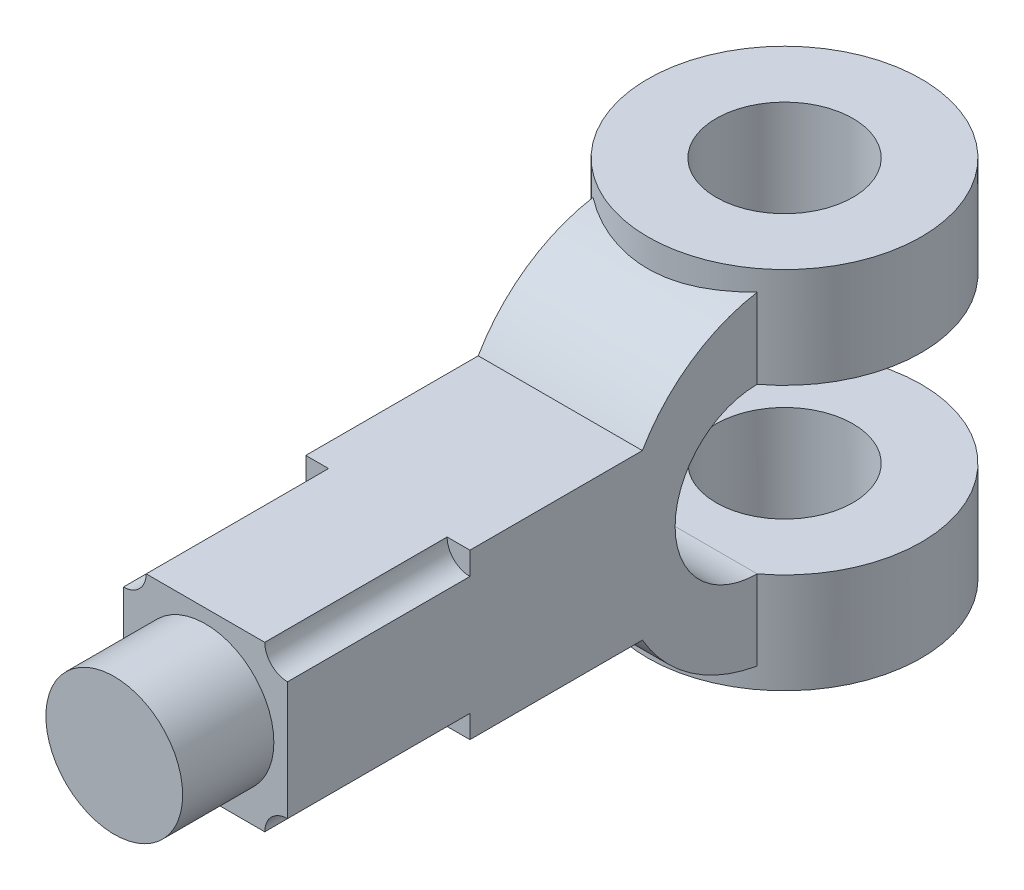
ISO-10303-21;
HEADER;
FILE_DESCRIPTION(('STEP AP214'),'2;1');
FILE_NAME('part.step','',(''),(''),'','','');
FILE_SCHEMA(('AUTOMOTIVE_DESIGN { 1 0 10303 214 1 1 1 1 }'));
ENDSEC;
DATA;
#1=APPLICATION_CONTEXT('core data for automotive mechanical design processes');
#2=APPLICATION_PROTOCOL_DEFINITION('international standard','automotive_design',2000,#1);
#3=PRODUCT_CONTEXT('',#1,'mechanical');
#4=PRODUCT('Part','Part','',(#3));
#5=PRODUCT_RELATED_PRODUCT_CATEGORY('part','',(#4));
#6=PRODUCT_DEFINITION_FORMATION('','',#4);
#7=PRODUCT_DEFINITION_CONTEXT('part definition',#1,'design');
#8=PRODUCT_DEFINITION('design','',#6,#7);
#9=PRODUCT_DEFINITION_SHAPE('','',#8);
#10=(LENGTH_UNIT() NAMED_UNIT(*) SI_UNIT(.MILLI.,.METRE.));
#11=(NAMED_UNIT(*) PLANE_ANGLE_UNIT() SI_UNIT($,.RADIAN.));
#12=(NAMED_UNIT(*) SI_UNIT($,.STERADIAN.) SOLID_ANGLE_UNIT());
#13=UNCERTAINTY_MEASURE_WITH_UNIT(LENGTH_MEASURE(1.E-05),#10,'distance_accuracy_value','');
#14=(GEOMETRIC_REPRESENTATION_CONTEXT(3) GLOBAL_UNCERTAINTY_ASSIGNED_CONTEXT((#13)) GLOBAL_UNIT_ASSIGNED_CONTEXT((#10,
#11,#12)) REPRESENTATION_CONTEXT('',''));
#15=CARTESIAN_POINT('',(0.,0.,0.));
#16=DIRECTION('',(0.,0.,1.));
#17=DIRECTION('',(1.,0.,0.));
#18=AXIS2_PLACEMENT_3D('',#15,#16,#17);
#19=CARTESIAN_POINT('',(0.,40.,-18.));
#20=DIRECTION('',(0.,-1.,0.));
#21=DIRECTION('',(0.,0.,-1.));
#22=AXIS2_PLACEMENT_3D('',#19,#20,#21);
#23=CYLINDRICAL_SURFACE('',#22,30.);
#24=CARTESIAN_POINT('',(0.,40.,-18.));
#25=DIRECTION('',(0.,1.,0.));
#26=DIRECTION('',(0.,0.,1.));
#27=AXIS2_PLACEMENT_3D('',#24,#25,#26);
#28=CIRCLE('',#27,30.);
#29=CARTESIAN_POINT('',(0.,40.,12.));
#30=VERTEX_POINT('',#29);
#31=EDGE_CURVE('E424',#30,#30,#28,.T.);
#32=ORIENTED_EDGE('',*,*,#31,.F.);
#33=EDGE_LOOP('',(#32));
#34=FACE_BOUND('',#33,.T.);
#35=DIRECTION('',(0.,-1.,0.));
#36=VECTOR('',#35,1.);
#37=CARTESIAN_POINT('',(18.,40.,6.00000000000001));
#38=LINE('',#37,#36);
#39=CARTESIAN_POINT('',(18.,18.,6.00000000000001));
#40=VERTEX_POINT('',#39);
#41=CARTESIAN_POINT('',(18.,35.4964786985977,6.00000000000001));
#42=VERTEX_POINT('',#41);
#43=EDGE_CURVE('E63',#40,#42,#38,.F.);
#44=ORIENTED_EDGE('',*,*,#43,.F.);
#45=CARTESIAN_POINT('',(0.,18.,-18.));
#46=DIRECTION('',(0.,1.,0.));
#47=DIRECTION('',(0.,0.,1.));
#48=AXIS2_PLACEMENT_3D('',#45,#46,#47);
#49=CIRCLE('',#48,30.);
#50=CARTESIAN_POINT('',(-18.,18.,6.00000000000001));
#51=VERTEX_POINT('',#50);
#52=EDGE_CURVE('E11',#40,#51,#49,.T.);
#53=ORIENTED_EDGE('',*,*,#52,.T.);
#54=DIRECTION('',(0.,-1.,0.));
#55=VECTOR('',#54,1.);
#56=CARTESIAN_POINT('',(-18.,40.,6.00000000000001));
#57=LINE('',#56,#55);
#58=CARTESIAN_POINT('',(-18.,35.4964786985977,6.00000000000001));
#59=VERTEX_POINT('',#58);
#60=EDGE_CURVE('E190',#51,#59,#57,.F.);
#61=ORIENTED_EDGE('',*,*,#60,.T.);
#62=CARTESIAN_POINT('',(-18.,35.4964786985977,6.00000000000001));
#63=CARTESIAN_POINT('',(-17.6652700488393,35.4540418888587,6.25104473685099));
#64=CARTESIAN_POINT('',(-17.3254588894004,35.4100755694517,6.49496287696561));
#65=CARTESIAN_POINT('',(-16.6361411055441,35.319987473131,6.96825300899079));
#66=CARTESIAN_POINT('',(-16.2866346965156,35.2738657440861,7.19762532367884));
#67=CARTESIAN_POINT('',(-15.224361309931,35.1336344154504,7.86343082113275));
#68=CARTESIAN_POINT('',(-14.4977350021615,35.0376448117858,8.2776313976723));
#69=CARTESIAN_POINT('',(-13.0106176994707,34.8474787700588,9.04488294946013));
#70=CARTESIAN_POINT('',(-12.2500524899578,34.7533070226002,9.39779073894099));
#71=CARTESIAN_POINT('',(-10.7011678817452,34.5735266205256,10.0390335159108));
#72=CARTESIAN_POINT('',(-9.91284943807475,34.4879176716399,10.3273707228594));
#73=CARTESIAN_POINT('',(-8.31212470789288,34.3309600251857,10.8377438083523));
#74=CARTESIAN_POINT('',(-7.49967959830294,34.2596359207948,11.0596656635286));
#75=CARTESIAN_POINT('',(-5.85756686392513,34.1363153236976,11.4346414692799));
#76=CARTESIAN_POINT('',(-5.02789921294297,34.0843188603897,11.5876953151035));
#77=CARTESIAN_POINT('',(-3.35910195711359,34.0033342771181,11.8232314080764));
#78=CARTESIAN_POINT('',(-2.51999361286517,33.9743021094198,11.9058487829932));
#79=CARTESIAN_POINT('',(-0.837326391333098,33.9411109954274,12.0001475979776));
#80=CARTESIAN_POINT('',(0.0062322712766498,33.9369508601431,12.0118324289261));
#81=CARTESIAN_POINT('',(1.65641745383172,33.9534385684128,11.9651363869785));
#82=CARTESIAN_POINT('',(2.4631369107436,33.9730738114726,11.909615532602));
#83=CARTESIAN_POINT('',(4.0686355518279,34.0342002504836,11.7337910476514));
#84=CARTESIAN_POINT('',(4.86741476119715,34.0756913770568,11.6134876227192));
#85=CARTESIAN_POINT('',(6.45265415602401,34.1779599907159,11.3089702469637));
#86=CARTESIAN_POINT('',(7.23909400302906,34.2387663955664,11.1246604304813));
#87=CARTESIAN_POINT('',(8.79328139515307,34.3758027333783,10.6937011780317));
#88=CARTESIAN_POINT('',(9.56102960596234,34.4520321161576,10.4470539657408));
#89=CARTESIAN_POINT('',(11.0051246545398,34.6077849465168,9.91817044679554));
#90=CARTESIAN_POINT('',(11.6834816686488,34.6863954939845,9.64113018835518));
#91=CARTESIAN_POINT('',(13.0176164276969,34.848297542607,9.03844326314263));
#92=CARTESIAN_POINT('',(13.6733957757199,34.9315887103135,8.71280005612538));
#93=CARTESIAN_POINT('',(14.9576830790064,35.0981755297543,8.01538337331857));
#94=CARTESIAN_POINT('',(15.5862582351749,35.1814705933355,7.64373349889216));
#95=CARTESIAN_POINT('',(16.8151014620769,35.3435474469705,6.85529510397645));
#96=CARTESIAN_POINT('',(17.4153673853043,35.4223288947237,6.43850316694264));
#97=CARTESIAN_POINT('',(18.,35.4964786985977,6.00000000000001));
#98=B_SPLINE_CURVE_WITH_KNOTS('',3,(#62,#63,#64,#65,#66,#67,#68,#69,#70,#71,#72,#73,#74,#75,#76,
#77,#78,#79,#80,#81,#82,#83,#84,#85,#86,#87,#88,#89,#90,#91,#92,#93,#94,#95,#96,#97),
.UNSPECIFIED.,.F.,.F.,(4,2,2,2,2,2,2,2,2,2,2,2,2,2,2,2,2,4),(0.,1.26147095102303,
2.52291389971485,5.04540453498827,7.57371092237957,10.1019303919279,12.6344657887177,
15.1670050376009,17.6946747720574,20.2222236720689,22.6458882558407,25.0695451461254,
27.4968478401918,29.9240639606397,32.1329767018888,34.3417322786998,36.5446776134851,
38.7477897932641),.UNSPECIFIED.);
#99=EDGE_CURVE('E343',#59,#42,#98,.T.);
#100=ORIENTED_EDGE('',*,*,#99,.T.);
#101=EDGE_LOOP('',(#44,#53,#61,#100));
#102=FACE_BOUND('',#101,.T.);
#103=ADVANCED_FACE('F45',(#34,#102),#23,.T.);
#104=CARTESIAN_POINT('',(18.,0.,0.));
#105=DIRECTION('',(-1.,0.,0.));
#106=DIRECTION('',(0.,0.,1.));
#107=AXIS2_PLACEMENT_3D('',#104,#105,#106);
#108=CYLINDRICAL_SURFACE('',#107,36.);
#109=CARTESIAN_POINT('',(18.,-35.4964786985977,6.00000000000001));
#110=CARTESIAN_POINT('',(17.6652700488393,-35.4540418888587,6.25104473685099));
#111=CARTESIAN_POINT('',(17.3254588894004,-35.4100755694517,6.49496287696561));
#112=CARTESIAN_POINT('',(16.6361411055441,-35.319987473131,6.96825300899079));
#113=CARTESIAN_POINT('',(16.2866346965156,-35.2738657440861,7.19762532367884));
#114=CARTESIAN_POINT('',(15.224361309931,-35.1336344154504,7.86343082113275));
#115=CARTESIAN_POINT('',(14.4977350021615,-35.0376448117858,8.2776313976723));
#116=CARTESIAN_POINT('',(13.0106176994707,-34.8474787700588,9.04488294946013));
#117=CARTESIAN_POINT('',(12.2500524899578,-34.7533070226002,9.39779073894099));
#118=CARTESIAN_POINT('',(10.7011678817452,-34.5735266205256,10.0390335159108));
#119=CARTESIAN_POINT('',(9.91284943807475,-34.4879176716399,10.3273707228594));
#120=CARTESIAN_POINT('',(8.31212470789288,-34.3309600251857,10.8377438083523));
#121=CARTESIAN_POINT('',(7.49967959830294,-34.2596359207948,11.0596656635286));
#122=CARTESIAN_POINT('',(5.85756686392513,-34.1363153236976,11.4346414692799));
#123=CARTESIAN_POINT('',(5.02789921294297,-34.0843188603897,11.5876953151035));
#124=CARTESIAN_POINT('',(3.35910195711359,-34.0033342771181,11.8232314080764));
#125=CARTESIAN_POINT('',(2.51999361286517,-33.9743021094198,11.9058487829932));
#126=CARTESIAN_POINT('',(0.837326391333098,-33.9411109954274,12.0001475979776));
#127=CARTESIAN_POINT('',(-0.0062322712766498,-33.9369508601431,12.0118324289261));
#128=CARTESIAN_POINT('',(-1.65641745383172,-33.9534385684128,11.9651363869785));
#129=CARTESIAN_POINT('',(-2.4631369107436,-33.9730738114726,11.909615532602));
#130=CARTESIAN_POINT('',(-4.0686355518279,-34.0342002504836,11.7337910476514));
#131=CARTESIAN_POINT('',(-4.86741476119715,-34.0756913770568,11.6134876227192));
#132=CARTESIAN_POINT('',(-6.45265415602401,-34.1779599907159,11.3089702469637));
#133=CARTESIAN_POINT('',(-7.23909400302906,-34.2387663955664,11.1246604304813));
#134=CARTESIAN_POINT('',(-8.79328139515307,-34.3758027333783,10.6937011780317));
#135=CARTESIAN_POINT('',(-9.56102960596234,-34.4520321161576,10.4470539657408));
#136=CARTESIAN_POINT('',(-11.0051246545398,-34.6077849465168,9.91817044679554));
#137=CARTESIAN_POINT('',(-11.6834816686488,-34.6863954939845,9.64113018835518));
#138=CARTESIAN_POINT('',(-13.0176164276969,-34.848297542607,9.03844326314263));
#139=CARTESIAN_POINT('',(-13.6733957757199,-34.9315887103135,8.71280005612538));
#140=CARTESIAN_POINT('',(-14.9576830790064,-35.0981755297543,8.01538337331857));
#141=CARTESIAN_POINT('',(-15.5862582351749,-35.1814705933355,7.64373349889216));
#142=CARTESIAN_POINT('',(-16.8151014620769,-35.3435474469705,6.85529510397645));
#143=CARTESIAN_POINT('',(-17.4153673853043,-35.4223288947237,6.43850316694264));
#144=CARTESIAN_POINT('',(-18.,-35.4964786985977,6.00000000000001));
#145=B_SPLINE_CURVE_WITH_KNOTS('',3,(#109,#110,#111,#112,#113,#114,#115,#116,#117,#118,#119,
#120,#121,#122,#123,#124,#125,#126,#127,#128,#129,#130,#131,#132,#133,#134,#135,#136,#137,#138,
#139,#140,#141,#142,#143,#144),.UNSPECIFIED.,.F.,.F.,(4,2,2,2,2,2,2,2,2,2,2,2,2,2,2,2,2,4),(0.,
1.26147095102303,2.52291389971485,5.04540453498827,7.57371092237957,10.1019303919279,
12.6344657887177,15.1670050376009,17.6946747720574,20.2222236720689,22.6458882558407,
25.0695451461254,27.4968478401918,29.9240639606397,32.1329767018888,34.3417322786998,
36.5446776134851,38.7477897932641),.UNSPECIFIED.);
#146=CARTESIAN_POINT('',(18.,-35.4964786985977,6.00000000000001));
#147=VERTEX_POINT('',#146);
#148=CARTESIAN_POINT('',(-18.,-35.4964786985977,6.00000000000001));
#149=VERTEX_POINT('',#148);
#150=EDGE_CURVE('E71',#147,#149,#145,.T.);
#151=ORIENTED_EDGE('',*,*,#150,.F.);
#152=CARTESIAN_POINT('',(18.,0.,0.));
#153=DIRECTION('',(1.,0.,0.));
#154=DIRECTION('',(0.,0.,-1.));
#155=AXIS2_PLACEMENT_3D('',#152,#153,#154);
#156=CIRCLE('',#155,36.);
#157=CARTESIAN_POINT('',(18.,-18.,31.1769145362398));
#158=VERTEX_POINT('',#157);
#159=EDGE_CURVE('E205',#158,#147,#156,.T.);
#160=ORIENTED_EDGE('',*,*,#159,.F.);
#161=DIRECTION('',(-1.,0.,0.));
#162=VECTOR('',#161,1.);
#163=CARTESIAN_POINT('',(18.,-18.,31.1769145362398));
#164=LINE('',#163,#162);
#165=CARTESIAN_POINT('',(-18.,-18.,31.1769145362398));
#166=VERTEX_POINT('',#165);
#167=EDGE_CURVE('E212',#166,#158,#164,.F.);
#168=ORIENTED_EDGE('',*,*,#167,.F.);
#169=CARTESIAN_POINT('',(-18.,0.,0.));
#170=DIRECTION('',(1.,0.,0.));
#171=DIRECTION('',(0.,0.,-1.));
#172=AXIS2_PLACEMENT_3D('',#169,#170,#171);
#173=CIRCLE('',#172,36.);
#174=EDGE_CURVE('E200',#166,#149,#173,.T.);
#175=ORIENTED_EDGE('',*,*,#174,.T.);
#176=EDGE_LOOP('',(#151,#160,#168,#175));
#177=FACE_BOUND('',#176,.T.);
#178=ADVANCED_FACE('F47',(#177),#108,.T.);
#179=ORIENTED_EDGE('',*,*,#99,.F.);
#180=CARTESIAN_POINT('',(-18.,18.,31.1769145362398));
#181=VERTEX_POINT('',#180);
#182=EDGE_CURVE('E204',#59,#181,#173,.T.);
#183=ORIENTED_EDGE('',*,*,#182,.T.);
#184=DIRECTION('',(-1.,0.,0.));
#185=VECTOR('',#184,1.);
#186=CARTESIAN_POINT('',(18.,18.,31.1769145362398));
#187=LINE('',#186,#185);
#188=CARTESIAN_POINT('',(18.,18.,31.1769145362398));
#189=VERTEX_POINT('',#188);
#190=EDGE_CURVE('E208',#189,#181,#187,.T.);
#191=ORIENTED_EDGE('',*,*,#190,.F.);
#192=EDGE_CURVE('E203',#42,#189,#156,.T.);
#193=ORIENTED_EDGE('',*,*,#192,.F.);
#194=EDGE_LOOP('',(#179,#183,#191,#193));
#195=FACE_BOUND('',#194,.T.);
#196=ADVANCED_FACE('F411',(#195),#108,.T.);
#197=CARTESIAN_POINT('',(18.,0.,0.));
#198=DIRECTION('',(1.,0.,0.));
#199=DIRECTION('',(0.,0.,-1.));
#200=AXIS2_PLACEMENT_3D('',#197,#198,#199);
#201=PLANE('',#200);
#202=CARTESIAN_POINT('',(18.,0.,6.00000000000001));
#203=DIRECTION('',(1.,0.,0.));
#204=DIRECTION('',(0.,0.,-1.));
#205=AXIS2_PLACEMENT_3D('',#202,#203,#204);
#206=CIRCLE('',#205,18.);
#207=CARTESIAN_POINT('',(18.,-18.,6.00000000000001));
#208=VERTEX_POINT('',#207);
#209=EDGE_CURVE('E180',#40,#208,#206,.T.);
#210=ORIENTED_EDGE('',*,*,#209,.F.);
#211=ORIENTED_EDGE('',*,*,#43,.T.);
#212=ORIENTED_EDGE('',*,*,#192,.T.);
#213=DIRECTION('',(0.,0.,-1.));
#214=VECTOR('',#213,1.);
#215=CARTESIAN_POINT('',(18.,18.,109.));
#216=LINE('',#215,#214);
#217=CARTESIAN_POINT('',(18.,18.,69.));
#218=VERTEX_POINT('',#217);
#219=EDGE_CURVE('E216',#218,#189,#216,.T.);
#220=ORIENTED_EDGE('',*,*,#219,.F.);
#221=DIRECTION('',(0.,1.,0.));
#222=VECTOR('',#221,1.);
#223=CARTESIAN_POINT('',(18.,18.,69.));
#224=LINE('',#223,#222);
#225=CARTESIAN_POINT('',(18.,13.,69.));
#226=VERTEX_POINT('',#225);
#227=EDGE_CURVE('E264',#226,#218,#224,.T.);
#228=ORIENTED_EDGE('',*,*,#227,.F.);
#229=DIRECTION('',(0.,0.,1.));
#230=VECTOR('',#229,1.);
#231=CARTESIAN_POINT('',(18.,13.,69.));
#232=LINE('',#231,#230);
#233=CARTESIAN_POINT('',(18.,13.,109.));
#234=VERTEX_POINT('',#233);
#235=EDGE_CURVE('E252',#226,#234,#232,.T.);
#236=ORIENTED_EDGE('',*,*,#235,.T.);
#237=DIRECTION('',(0.,1.,0.));
#238=VECTOR('',#237,1.);
#239=CARTESIAN_POINT('',(18.,18.,109.));
#240=LINE('',#239,#238);
#241=CARTESIAN_POINT('',(18.,-12.9999999999998,109.));
#242=VERTEX_POINT('',#241);
#243=EDGE_CURVE('E242',#242,#234,#240,.T.);
#244=ORIENTED_EDGE('',*,*,#243,.F.);
#245=DIRECTION('',(0.,0.,1.));
#246=VECTOR('',#245,1.);
#247=CARTESIAN_POINT('',(18.0000000000001,-12.9999999999998,69.));
#248=LINE('',#247,#246);
#249=CARTESIAN_POINT('',(18.0000000000001,-12.9999999999998,69.));
#250=VERTEX_POINT('',#249);
#251=EDGE_CURVE('E274',#250,#242,#248,.T.);
#252=ORIENTED_EDGE('',*,*,#251,.F.);
#253=DIRECTION('',(0.,1.,0.));
#254=VECTOR('',#253,1.);
#255=CARTESIAN_POINT('',(18.0000000000001,-12.9999999999998,69.));
#256=LINE('',#255,#254);
#257=CARTESIAN_POINT('',(18.0000000000002,-17.9999999999998,69.));
#258=VERTEX_POINT('',#257);
#259=EDGE_CURVE('E291',#258,#250,#256,.T.);
#260=ORIENTED_EDGE('',*,*,#259,.F.);
#261=DIRECTION('',(0.,0.,-1.));
#262=VECTOR('',#261,1.);
#263=CARTESIAN_POINT('',(18.,-18.,109.));
#264=LINE('',#263,#262);
#265=EDGE_CURVE('E227',#258,#158,#264,.T.);
#266=ORIENTED_EDGE('',*,*,#265,.T.);
#267=ORIENTED_EDGE('',*,*,#159,.T.);
#268=EDGE_CURVE('E287',#147,#208,#38,.F.);
#269=ORIENTED_EDGE('',*,*,#268,.T.);
#270=EDGE_LOOP('',(#210,#211,#212,#220,#228,#236,#244,#252,#260,#266,#267,#269));
#271=FACE_BOUND('',#270,.T.);
#272=ADVANCED_FACE('F409',(#271),#201,.T.);
#273=CARTESIAN_POINT('',(-18.,0.,0.));
#274=DIRECTION('',(1.,0.,0.));
#275=DIRECTION('',(0.,0.,-1.));
#276=AXIS2_PLACEMENT_3D('',#273,#274,#275);
#277=PLANE('',#276);
#278=ORIENTED_EDGE('',*,*,#60,.F.);
#279=CARTESIAN_POINT('',(-18.,0.,6.00000000000001));
#280=DIRECTION('',(1.,0.,0.));
#281=DIRECTION('',(0.,0.,-1.));
#282=AXIS2_PLACEMENT_3D('',#279,#280,#281);
#283=CIRCLE('',#282,18.);
#284=CARTESIAN_POINT('',(-18.,-18.,6.00000000000001));
#285=VERTEX_POINT('',#284);
#286=EDGE_CURVE('E178',#51,#285,#283,.T.);
#287=ORIENTED_EDGE('',*,*,#286,.T.);
#288=EDGE_CURVE('E171',#149,#285,#57,.F.);
#289=ORIENTED_EDGE('',*,*,#288,.F.);
#290=ORIENTED_EDGE('',*,*,#174,.F.);
#291=DIRECTION('',(0.,0.,-1.));
#292=VECTOR('',#291,1.);
#293=CARTESIAN_POINT('',(-18.,-18.,109.));
#294=LINE('',#293,#292);
#295=CARTESIAN_POINT('',(-18.,-18.,69.));
#296=VERTEX_POINT('',#295);
#297=EDGE_CURVE('E224',#296,#166,#294,.T.);
#298=ORIENTED_EDGE('',*,*,#297,.F.);
#299=DIRECTION('',(0.,-1.,0.));
#300=VECTOR('',#299,1.);
#301=CARTESIAN_POINT('',(-18.,-18.,69.));
#302=LINE('',#301,#300);
#303=CARTESIAN_POINT('',(-18.,-13.,69.));
#304=VERTEX_POINT('',#303);
#305=EDGE_CURVE('E307',#304,#296,#302,.T.);
#306=ORIENTED_EDGE('',*,*,#305,.F.);
#307=DIRECTION('',(0.,0.,1.));
#308=VECTOR('',#307,1.);
#309=CARTESIAN_POINT('',(-18.,-13.,69.));
#310=LINE('',#309,#308);
#311=CARTESIAN_POINT('',(-18.,-13.,109.));
#312=VERTEX_POINT('',#311);
#313=EDGE_CURVE('E299',#304,#312,#310,.T.);
#314=ORIENTED_EDGE('',*,*,#313,.T.);
#315=DIRECTION('',(0.,-1.,0.));
#316=VECTOR('',#315,1.);
#317=CARTESIAN_POINT('',(-18.,18.,109.));
#318=LINE('',#317,#316);
#319=CARTESIAN_POINT('',(-18.,12.9999999999999,109.));
#320=VERTEX_POINT('',#319);
#321=EDGE_CURVE('E234',#320,#312,#318,.T.);
#322=ORIENTED_EDGE('',*,*,#321,.F.);
#323=DIRECTION('',(0.,0.,1.));
#324=VECTOR('',#323,1.);
#325=CARTESIAN_POINT('',(-18.,12.9999999999999,69.));
#326=LINE('',#325,#324);
#327=CARTESIAN_POINT('',(-18.,12.9999999999999,69.));
#328=VERTEX_POINT('',#327);
#329=EDGE_CURVE('E316',#328,#320,#326,.T.);
#330=ORIENTED_EDGE('',*,*,#329,.F.);
#331=DIRECTION('',(0.,-1.,0.));
#332=VECTOR('',#331,1.);
#333=CARTESIAN_POINT('',(-18.,12.9999999999999,69.));
#334=LINE('',#333,#332);
#335=CARTESIAN_POINT('',(-18.0000000000001,17.9999999999999,69.));
#336=VERTEX_POINT('',#335);
#337=EDGE_CURVE('E329',#336,#328,#334,.T.);
#338=ORIENTED_EDGE('',*,*,#337,.F.);
#339=DIRECTION('',(0.,0.,-1.));
#340=VECTOR('',#339,1.);
#341=CARTESIAN_POINT('',(-18.,18.,109.));
#342=LINE('',#341,#340);
#343=EDGE_CURVE('E220',#336,#181,#342,.T.);
#344=ORIENTED_EDGE('',*,*,#343,.T.);
#345=ORIENTED_EDGE('',*,*,#182,.F.);
#346=EDGE_LOOP('',(#278,#287,#289,#290,#298,#306,#314,#322,#330,#338,#344,#345));
#347=FACE_BOUND('',#346,.T.);
#348=ADVANCED_FACE('F187',(#347),#277,.F.);
#349=CARTESIAN_POINT('',(-18.,18.,109.));
#350=DIRECTION('',(0.,-1.,0.));
#351=DIRECTION('',(0.,0.,-1.));
#352=AXIS2_PLACEMENT_3D('',#349,#350,#351);
#353=PLANE('',#352);
#354=DIRECTION('',(-1.,0.,0.));
#355=VECTOR('',#354,1.);
#356=CARTESIAN_POINT('',(-18.0000000000001,17.9999999999999,69.));
#357=LINE('',#356,#355);
#358=CARTESIAN_POINT('',(-13.0000000000001,18.,69.));
#359=VERTEX_POINT('',#358);
#360=EDGE_CURVE('E325',#359,#336,#357,.T.);
#361=ORIENTED_EDGE('',*,*,#360,.F.);
#362=DIRECTION('',(0.,0.,1.));
#363=VECTOR('',#362,1.);
#364=CARTESIAN_POINT('',(-13.0000000000001,18.,69.));
#365=LINE('',#364,#363);
#366=CARTESIAN_POINT('',(-13.0000000000001,18.,109.));
#367=VERTEX_POINT('',#366);
#368=EDGE_CURVE('E265',#359,#367,#365,.T.);
#369=ORIENTED_EDGE('',*,*,#368,.T.);
#370=DIRECTION('',(-1.,0.,0.));
#371=VECTOR('',#370,1.);
#372=CARTESIAN_POINT('',(-18.,18.,109.));
#373=LINE('',#372,#371);
#374=CARTESIAN_POINT('',(13.,18.,109.));
#375=VERTEX_POINT('',#374);
#376=EDGE_CURVE('E238',#375,#367,#373,.T.);
#377=ORIENTED_EDGE('',*,*,#376,.F.);
#378=DIRECTION('',(0.,0.,1.));
#379=VECTOR('',#378,1.);
#380=CARTESIAN_POINT('',(13.,18.,69.));
#381=LINE('',#380,#379);
#382=CARTESIAN_POINT('',(13.,18.,69.));
#383=VERTEX_POINT('',#382);
#384=EDGE_CURVE('E253',#383,#375,#381,.T.);
#385=ORIENTED_EDGE('',*,*,#384,.F.);
#386=DIRECTION('',(-1.,0.,0.));
#387=VECTOR('',#386,1.);
#388=CARTESIAN_POINT('',(13.,18.,69.));
#389=LINE('',#388,#387);
#390=EDGE_CURVE('E269',#218,#383,#389,.T.);
#391=ORIENTED_EDGE('',*,*,#390,.F.);
#392=ORIENTED_EDGE('',*,*,#219,.T.);
#393=ORIENTED_EDGE('',*,*,#190,.T.);
#394=ORIENTED_EDGE('',*,*,#343,.F.);
#395=EDGE_LOOP('',(#361,#369,#377,#385,#391,#392,#393,#394));
#396=FACE_BOUND('',#395,.T.);
#397=ADVANCED_FACE('F404',(#396),#353,.F.);
#398=CARTESIAN_POINT('',(-18.,-18.,109.));
#399=DIRECTION('',(0.,1.,0.));
#400=DIRECTION('',(0.,0.,1.));
#401=AXIS2_PLACEMENT_3D('',#398,#399,#400);
#402=PLANE('',#401);
#403=DIRECTION('',(1.,0.,0.));
#404=VECTOR('',#403,1.);
#405=CARTESIAN_POINT('',(-18.,-18.,109.));
#406=LINE('',#405,#404);
#407=CARTESIAN_POINT('',(-13.,-18.,109.));
#408=VERTEX_POINT('',#407);
#409=CARTESIAN_POINT('',(13.0000000000002,-17.9999999999999,109.));
#410=VERTEX_POINT('',#409);
#411=EDGE_CURVE('E230',#408,#410,#406,.T.);
#412=ORIENTED_EDGE('',*,*,#411,.F.);
#413=DIRECTION('',(0.,0.,1.));
#414=VECTOR('',#413,1.);
#415=CARTESIAN_POINT('',(-13.,-18.,69.));
#416=LINE('',#415,#414);
#417=CARTESIAN_POINT('',(-13.,-18.,69.));
#418=VERTEX_POINT('',#417);
#419=EDGE_CURVE('E296',#418,#408,#416,.T.);
#420=ORIENTED_EDGE('',*,*,#419,.F.);
#421=DIRECTION('',(1.,0.,0.));
#422=VECTOR('',#421,1.);
#423=CARTESIAN_POINT('',(-13.,-18.,69.));
#424=LINE('',#423,#422);
#425=EDGE_CURVE('E311',#296,#418,#424,.T.);
#426=ORIENTED_EDGE('',*,*,#425,.F.);
#427=ORIENTED_EDGE('',*,*,#297,.T.);
#428=ORIENTED_EDGE('',*,*,#167,.T.);
#429=ORIENTED_EDGE('',*,*,#265,.F.);
#430=DIRECTION('',(1.,0.,0.));
#431=VECTOR('',#430,1.);
#432=CARTESIAN_POINT('',(18.0000000000002,-17.9999999999998,69.));
#433=LINE('',#432,#431);
#434=CARTESIAN_POINT('',(13.0000000000002,-17.9999999999999,69.));
#435=VERTEX_POINT('',#434);
#436=EDGE_CURVE('E286',#435,#258,#433,.T.);
#437=ORIENTED_EDGE('',*,*,#436,.F.);
#438=DIRECTION('',(0.,0.,1.));
#439=VECTOR('',#438,1.);
#440=CARTESIAN_POINT('',(13.0000000000002,-17.9999999999999,69.));
#441=LINE('',#440,#439);
#442=EDGE_CURVE('E277',#435,#410,#441,.T.);
#443=ORIENTED_EDGE('',*,*,#442,.T.);
#444=EDGE_LOOP('',(#412,#420,#426,#427,#428,#429,#437,#443));
#445=FACE_BOUND('',#444,.T.);
#446=ADVANCED_FACE('F400',(#445),#402,.F.);
#447=CARTESIAN_POINT('',(0.,0.,109.));
#448=DIRECTION('',(0.,0.,1.));
#449=DIRECTION('',(1.,0.,0.));
#450=AXIS2_PLACEMENT_3D('',#447,#448,#449);
#451=PLANE('',#450);
#452=CARTESIAN_POINT('',(-18.0000000000001,17.9999999999999,109.));
#453=DIRECTION('',(0.,0.,1.));
#454=DIRECTION('',(0.,1.,0.));
#455=AXIS2_PLACEMENT_3D('',#452,#453,#454);
#456=CIRCLE('',#455,5.);
#457=EDGE_CURVE('E304',#320,#367,#456,.T.);
#458=ORIENTED_EDGE('',*,*,#457,.F.);
#459=ORIENTED_EDGE('',*,*,#321,.T.);
#460=CARTESIAN_POINT('',(-18.,-18.,109.));
#461=DIRECTION('',(0.,0.,1.));
#462=DIRECTION('',(-1.,0.,0.));
#463=AXIS2_PLACEMENT_3D('',#460,#461,#462);
#464=CIRCLE('',#463,5.);
#465=EDGE_CURVE('E282',#408,#312,#464,.T.);
#466=ORIENTED_EDGE('',*,*,#465,.F.);
#467=ORIENTED_EDGE('',*,*,#411,.T.);
#468=CARTESIAN_POINT('',(18.0000000000002,-17.9999999999998,109.));
#469=DIRECTION('',(0.,0.,1.));
#470=DIRECTION('',(0.,-1.,0.));
#471=AXIS2_PLACEMENT_3D('',#468,#469,#470);
#472=CIRCLE('',#471,5.);
#473=EDGE_CURVE('E283',#242,#410,#472,.T.);
#474=ORIENTED_EDGE('',*,*,#473,.F.);
#475=ORIENTED_EDGE('',*,*,#243,.T.);
#476=CARTESIAN_POINT('',(18.,18.,109.));
#477=DIRECTION('',(0.,0.,1.));
#478=DIRECTION('',(1.,0.,0.));
#479=AXIS2_PLACEMENT_3D('',#476,#477,#478);
#480=CIRCLE('',#479,5.);
#481=EDGE_CURVE('E260',#375,#234,#480,.T.);
#482=ORIENTED_EDGE('',*,*,#481,.F.);
#483=ORIENTED_EDGE('',*,*,#376,.T.);
#484=EDGE_LOOP('',(#458,#459,#466,#467,#474,#475,#482,#483));
#485=FACE_BOUND('',#484,.T.);
#486=CARTESIAN_POINT('',(0.,0.,109.));
#487=DIRECTION('',(0.,0.,1.));
#488=DIRECTION('',(1.,0.,0.));
#489=AXIS2_PLACEMENT_3D('',#486,#487,#488);
#490=CIRCLE('',#489,15.);
#491=CARTESIAN_POINT('',(15.,0.,109.));
#492=VERTEX_POINT('',#491);
#493=EDGE_CURVE('E198',#492,#492,#490,.T.);
#494=ORIENTED_EDGE('',*,*,#493,.F.);
#495=EDGE_LOOP('',(#494));
#496=FACE_BOUND('',#495,.T.);
#497=ADVANCED_FACE('F396',(#485,#496),#451,.T.);
#498=CARTESIAN_POINT('',(0.,0.,129.));
#499=DIRECTION('',(0.,0.,-1.));
#500=DIRECTION('',(-1.,0.,0.));
#501=AXIS2_PLACEMENT_3D('',#498,#499,#500);
#502=CYLINDRICAL_SURFACE('',#501,15.);
#503=CARTESIAN_POINT('',(0.,0.,129.));
#504=DIRECTION('',(0.,0.,1.));
#505=DIRECTION('',(1.,0.,0.));
#506=AXIS2_PLACEMENT_3D('',#503,#504,#505);
#507=CIRCLE('',#506,15.);
#508=CARTESIAN_POINT('',(15.,0.,129.));
#509=VERTEX_POINT('',#508);
#510=EDGE_CURVE('E245',#509,#509,#507,.T.);
#511=ORIENTED_EDGE('',*,*,#510,.F.);
#512=EDGE_LOOP('',(#511));
#513=FACE_BOUND('',#512,.T.);
#514=ORIENTED_EDGE('',*,*,#493,.T.);
#515=EDGE_LOOP('',(#514));
#516=FACE_BOUND('',#515,.T.);
#517=ADVANCED_FACE('F392',(#513,#516),#502,.T.);
#518=CARTESIAN_POINT('',(0.,0.,129.));
#519=DIRECTION('',(0.,0.,1.));
#520=DIRECTION('',(1.,0.,0.));
#521=AXIS2_PLACEMENT_3D('',#518,#519,#520);
#522=PLANE('',#521);
#523=ORIENTED_EDGE('',*,*,#510,.T.);
#524=EDGE_LOOP('',(#523));
#525=FACE_BOUND('',#524,.T.);
#526=ADVANCED_FACE('F388',(#525),#522,.T.);
#527=CARTESIAN_POINT('',(18.,18.,69.));
#528=DIRECTION('',(0.,0.,1.));
#529=DIRECTION('',(1.,0.,0.));
#530=AXIS2_PLACEMENT_3D('',#527,#528,#529);
#531=CYLINDRICAL_SURFACE('',#530,5.);
#532=ORIENTED_EDGE('',*,*,#481,.T.);
#533=ORIENTED_EDGE('',*,*,#235,.F.);
#534=CARTESIAN_POINT('',(18.,18.,69.));
#535=DIRECTION('',(0.,0.,1.));
#536=DIRECTION('',(1.,0.,0.));
#537=AXIS2_PLACEMENT_3D('',#534,#535,#536);
#538=CIRCLE('',#537,5.);
#539=EDGE_CURVE('E256',#383,#226,#538,.T.);
#540=ORIENTED_EDGE('',*,*,#539,.F.);
#541=ORIENTED_EDGE('',*,*,#384,.T.);
#542=EDGE_LOOP('',(#532,#533,#540,#541));
#543=FACE_BOUND('',#542,.T.);
#544=ADVANCED_FACE('F384',(#543),#531,.F.);
#545=CARTESIAN_POINT('',(18.,18.,69.));
#546=DIRECTION('',(0.,0.,1.));
#547=DIRECTION('',(1.,0.,0.));
#548=AXIS2_PLACEMENT_3D('',#545,#546,#547);
#549=PLANE('',#548);
#550=ORIENTED_EDGE('',*,*,#227,.T.);
#551=ORIENTED_EDGE('',*,*,#390,.T.);
#552=ORIENTED_EDGE('',*,*,#539,.T.);
#553=EDGE_LOOP('',(#550,#551,#552));
#554=FACE_BOUND('',#553,.T.);
#555=ADVANCED_FACE('F380',(#554),#549,.T.);
#556=CARTESIAN_POINT('',(18.0000000000002,-17.9999999999998,69.));
#557=DIRECTION('',(0.,0.,1.));
#558=DIRECTION('',(1.,0.,0.));
#559=AXIS2_PLACEMENT_3D('',#556,#557,#558);
#560=CYLINDRICAL_SURFACE('',#559,5.);
#561=ORIENTED_EDGE('',*,*,#473,.T.);
#562=ORIENTED_EDGE('',*,*,#442,.F.);
#563=CARTESIAN_POINT('',(18.0000000000002,-17.9999999999998,69.));
#564=DIRECTION('',(0.,0.,1.));
#565=DIRECTION('',(0.,-1.,0.));
#566=AXIS2_PLACEMENT_3D('',#563,#564,#565);
#567=CIRCLE('',#566,5.);
#568=EDGE_CURVE('E278',#250,#435,#567,.T.);
#569=ORIENTED_EDGE('',*,*,#568,.F.);
#570=ORIENTED_EDGE('',*,*,#251,.T.);
#571=EDGE_LOOP('',(#561,#562,#569,#570));
#572=FACE_BOUND('',#571,.T.);
#573=ADVANCED_FACE('F376',(#572),#560,.F.);
#574=CARTESIAN_POINT('',(18.0000000000002,-17.9999999999998,69.));
#575=DIRECTION('',(0.,0.,1.));
#576=DIRECTION('',(0.,-1.,0.));
#577=AXIS2_PLACEMENT_3D('',#574,#575,#576);
#578=PLANE('',#577);
#579=ORIENTED_EDGE('',*,*,#436,.T.);
#580=ORIENTED_EDGE('',*,*,#259,.T.);
#581=ORIENTED_EDGE('',*,*,#568,.T.);
#582=EDGE_LOOP('',(#579,#580,#581));
#583=FACE_BOUND('',#582,.T.);
#584=ADVANCED_FACE('F372',(#583),#578,.T.);
#585=CARTESIAN_POINT('',(-18.,-18.,69.));
#586=DIRECTION('',(0.,0.,1.));
#587=DIRECTION('',(1.,0.,0.));
#588=AXIS2_PLACEMENT_3D('',#585,#586,#587);
#589=CYLINDRICAL_SURFACE('',#588,5.);
#590=ORIENTED_EDGE('',*,*,#465,.T.);
#591=ORIENTED_EDGE('',*,*,#313,.F.);
#592=CARTESIAN_POINT('',(-18.,-18.,69.));
#593=DIRECTION('',(0.,0.,1.));
#594=DIRECTION('',(-1.,0.,0.));
#595=AXIS2_PLACEMENT_3D('',#592,#593,#594);
#596=CIRCLE('',#595,5.);
#597=EDGE_CURVE('E300',#418,#304,#596,.T.);
#598=ORIENTED_EDGE('',*,*,#597,.F.);
#599=ORIENTED_EDGE('',*,*,#419,.T.);
#600=EDGE_LOOP('',(#590,#591,#598,#599));
#601=FACE_BOUND('',#600,.T.);
#602=ADVANCED_FACE('F368',(#601),#589,.F.);
#603=CARTESIAN_POINT('',(-18.,-18.,69.));
#604=DIRECTION('',(0.,0.,1.));
#605=DIRECTION('',(-1.,0.,0.));
#606=AXIS2_PLACEMENT_3D('',#603,#604,#605);
#607=PLANE('',#606);
#608=ORIENTED_EDGE('',*,*,#305,.T.);
#609=ORIENTED_EDGE('',*,*,#425,.T.);
#610=ORIENTED_EDGE('',*,*,#597,.T.);
#611=EDGE_LOOP('',(#608,#609,#610));
#612=FACE_BOUND('',#611,.T.);
#613=ADVANCED_FACE('F364',(#612),#607,.T.);
#614=CARTESIAN_POINT('',(-18.0000000000001,17.9999999999999,69.));
#615=DIRECTION('',(0.,0.,1.));
#616=DIRECTION('',(1.,0.,0.));
#617=AXIS2_PLACEMENT_3D('',#614,#615,#616);
#618=CYLINDRICAL_SURFACE('',#617,5.);
#619=ORIENTED_EDGE('',*,*,#457,.T.);
#620=ORIENTED_EDGE('',*,*,#368,.F.);
#621=CARTESIAN_POINT('',(-18.0000000000001,17.9999999999999,69.));
#622=DIRECTION('',(0.,0.,1.));
#623=DIRECTION('',(0.,1.,0.));
#624=AXIS2_PLACEMENT_3D('',#621,#622,#623);
#625=CIRCLE('',#624,5.);
#626=EDGE_CURVE('E319',#328,#359,#625,.T.);
#627=ORIENTED_EDGE('',*,*,#626,.F.);
#628=ORIENTED_EDGE('',*,*,#329,.T.);
#629=EDGE_LOOP('',(#619,#620,#627,#628));
#630=FACE_BOUND('',#629,.T.);
#631=ADVANCED_FACE('F360',(#630),#618,.F.);
#632=CARTESIAN_POINT('',(-18.0000000000001,17.9999999999999,69.));
#633=DIRECTION('',(0.,0.,1.));
#634=DIRECTION('',(0.,1.,0.));
#635=AXIS2_PLACEMENT_3D('',#632,#633,#634);
#636=PLANE('',#635);
#637=ORIENTED_EDGE('',*,*,#360,.T.);
#638=ORIENTED_EDGE('',*,*,#337,.T.);
#639=ORIENTED_EDGE('',*,*,#626,.T.);
#640=EDGE_LOOP('',(#637,#638,#639));
#641=FACE_BOUND('',#640,.T.);
#642=ADVANCED_FACE('F354',(#641),#636,.T.);
#643=ORIENTED_EDGE('',*,*,#288,.T.);
#644=CARTESIAN_POINT('',(0.,-18.,-18.));
#645=DIRECTION('',(0.,-1.,0.));
#646=DIRECTION('',(0.,0.,-1.));
#647=AXIS2_PLACEMENT_3D('',#644,#645,#646);
#648=CIRCLE('',#647,30.);
#649=EDGE_CURVE('E56',#285,#208,#648,.T.);
#650=ORIENTED_EDGE('',*,*,#649,.T.);
#651=ORIENTED_EDGE('',*,*,#268,.F.);
#652=ORIENTED_EDGE('',*,*,#150,.T.);
#653=EDGE_LOOP('',(#643,#650,#651,#652));
#654=FACE_BOUND('',#653,.T.);
#655=CARTESIAN_POINT('',(0.,-40.,-18.));
#656=DIRECTION('',(0.,1.,0.));
#657=DIRECTION('',(0.,0.,1.));
#658=AXIS2_PLACEMENT_3D('',#655,#656,#657);
#659=CIRCLE('',#658,30.);
#660=CARTESIAN_POINT('',(0.,-40.,12.));
#661=VERTEX_POINT('',#660);
#662=EDGE_CURVE('E431',#661,#661,#659,.T.);
#663=ORIENTED_EDGE('',*,*,#662,.T.);
#664=EDGE_LOOP('',(#663));
#665=FACE_BOUND('',#664,.T.);
#666=ADVANCED_FACE('F193',(#654,#665),#23,.T.);
#667=CARTESIAN_POINT('',(0.,40.,-18.));
#668=DIRECTION('',(0.,1.,0.));
#669=DIRECTION('',(0.,0.,1.));
#670=AXIS2_PLACEMENT_3D('',#667,#668,#669);
#671=PLANE('',#670);
#672=CARTESIAN_POINT('',(0.,40.,-18.));
#673=DIRECTION('',(0.,1.,0.));
#674=DIRECTION('',(0.,0.,1.));
#675=AXIS2_PLACEMENT_3D('',#672,#673,#674);
#676=CIRCLE('',#675,15.);
#677=CARTESIAN_POINT('',(0.,40.,-2.99999999999998));
#678=VERTEX_POINT('',#677);
#679=EDGE_CURVE('E447',#678,#678,#676,.T.);
#680=ORIENTED_EDGE('',*,*,#679,.F.);
#681=EDGE_LOOP('',(#680));
#682=FACE_BOUND('',#681,.T.);
#683=ORIENTED_EDGE('',*,*,#31,.T.);
#684=EDGE_LOOP('',(#683));
#685=FACE_BOUND('',#684,.T.);
#686=ADVANCED_FACE('F353',(#682,#685),#671,.T.);
#687=CARTESIAN_POINT('',(0.,-40.,-18.));
#688=DIRECTION('',(0.,1.,0.));
#689=DIRECTION('',(0.,0.,1.));
#690=AXIS2_PLACEMENT_3D('',#687,#688,#689);
#691=PLANE('',#690);
#692=CARTESIAN_POINT('',(0.,-40.,-18.));
#693=DIRECTION('',(0.,1.,0.));
#694=DIRECTION('',(0.,0.,1.));
#695=AXIS2_PLACEMENT_3D('',#692,#693,#694);
#696=CIRCLE('',#695,15.);
#697=CARTESIAN_POINT('',(0.,-40.,-2.99999999999999));
#698=VERTEX_POINT('',#697);
#699=EDGE_CURVE('E444',#698,#698,#696,.T.);
#700=ORIENTED_EDGE('',*,*,#699,.T.);
#701=EDGE_LOOP('',(#700));
#702=FACE_BOUND('',#701,.T.);
#703=ORIENTED_EDGE('',*,*,#662,.F.);
#704=EDGE_LOOP('',(#703));
#705=FACE_BOUND('',#704,.T.);
#706=ADVANCED_FACE('F355',(#702,#705),#691,.F.);
#707=CARTESIAN_POINT('',(-30.,0.,6.00000000000001));
#708=DIRECTION('',(1.,0.,0.));
#709=DIRECTION('',(0.,0.,-1.));
#710=AXIS2_PLACEMENT_3D('',#707,#708,#709);
#711=CYLINDRICAL_SURFACE('',#710,18.);
#712=ORIENTED_EDGE('',*,*,#209,.T.);
#713=DIRECTION('',(1.,0.,0.));
#714=VECTOR('',#713,1.);
#715=CARTESIAN_POINT('',(-30.,-18.,6.00000000000001));
#716=LINE('',#715,#714);
#717=EDGE_CURVE('E165',#285,#208,#716,.T.);
#718=ORIENTED_EDGE('',*,*,#717,.F.);
#719=ORIENTED_EDGE('',*,*,#286,.F.);
#720=DIRECTION('',(1.,0.,0.));
#721=VECTOR('',#720,1.);
#722=CARTESIAN_POINT('',(-30.,18.,6.00000000000001));
#723=LINE('',#722,#721);
#724=EDGE_CURVE('E182',#51,#40,#723,.T.);
#725=ORIENTED_EDGE('',*,*,#724,.T.);
#726=EDGE_LOOP('',(#712,#718,#719,#725));
#727=FACE_BOUND('',#726,.T.);
#728=ADVANCED_FACE('F176',(#727),#711,.F.);
#729=CARTESIAN_POINT('',(-30.,18.,6.00000000000001));
#730=DIRECTION('',(0.,1.,0.));
#731=DIRECTION('',(0.,0.,1.));
#732=AXIS2_PLACEMENT_3D('',#729,#730,#731);
#733=PLANE('',#732);
#734=CARTESIAN_POINT('',(0.,18.,-18.));
#735=DIRECTION('',(0.,1.,0.));
#736=DIRECTION('',(0.,0.,1.));
#737=AXIS2_PLACEMENT_3D('',#734,#735,#736);
#738=CIRCLE('',#737,15.);
#739=CARTESIAN_POINT('',(0.,18.,-2.99999999999998));
#740=VERTEX_POINT('',#739);
#741=EDGE_CURVE('E183',#740,#740,#738,.T.);
#742=ORIENTED_EDGE('',*,*,#741,.T.);
#743=EDGE_LOOP('',(#742));
#744=FACE_BOUND('',#743,.T.);
#745=ORIENTED_EDGE('',*,*,#724,.F.);
#746=ORIENTED_EDGE('',*,*,#52,.F.);
#747=EDGE_LOOP('',(#745,#746));
#748=FACE_BOUND('',#747,.T.);
#749=ADVANCED_FACE('F465',(#744,#748),#733,.F.);
#750=CARTESIAN_POINT('',(-30.,-18.,-48.));
#751=DIRECTION('',(0.,-1.,0.));
#752=DIRECTION('',(0.,0.,-1.));
#753=AXIS2_PLACEMENT_3D('',#750,#751,#752);
#754=PLANE('',#753);
#755=CARTESIAN_POINT('',(0.,-18.,-18.));
#756=DIRECTION('',(0.,-1.,0.));
#757=DIRECTION('',(0.,0.,-1.));
#758=AXIS2_PLACEMENT_3D('',#755,#756,#757);
#759=CIRCLE('',#758,15.);
#760=CARTESIAN_POINT('',(0.,-18.,-33.));
#761=VERTEX_POINT('',#760);
#762=EDGE_CURVE('E50',#761,#761,#759,.T.);
#763=ORIENTED_EDGE('',*,*,#762,.T.);
#764=EDGE_LOOP('',(#763));
#765=FACE_BOUND('',#764,.T.);
#766=ORIENTED_EDGE('',*,*,#649,.F.);
#767=ORIENTED_EDGE('',*,*,#717,.T.);
#768=EDGE_LOOP('',(#766,#767));
#769=FACE_BOUND('',#768,.T.);
#770=ADVANCED_FACE('F164',(#765,#769),#754,.F.);
#771=CARTESIAN_POINT('',(0.,40.,-18.));
#772=DIRECTION('',(0.,1.,0.));
#773=DIRECTION('',(0.,0.,1.));
#774=AXIS2_PLACEMENT_3D('',#771,#772,#773);
#775=CYLINDRICAL_SURFACE('',#774,15.);
#776=ORIENTED_EDGE('',*,*,#699,.F.);
#777=EDGE_LOOP('',(#776));
#778=FACE_BOUND('',#777,.T.);
#779=ORIENTED_EDGE('',*,*,#762,.F.);
#780=EDGE_LOOP('',(#779));
#781=FACE_BOUND('',#780,.T.);
#782=ADVANCED_FACE('F468',(#778,#781),#775,.F.);
#783=ORIENTED_EDGE('',*,*,#679,.T.);
#784=EDGE_LOOP('',(#783));
#785=FACE_BOUND('',#784,.T.);
#786=ORIENTED_EDGE('',*,*,#741,.F.);
#787=EDGE_LOOP('',(#786));
#788=FACE_BOUND('',#787,.T.);
#789=ADVANCED_FACE('F453',(#785,#788),#775,.F.);
#790=CLOSED_SHELL('',(#103,#178,#196,#272,#348,#397,#446,#497,#517,#526,#544,#555,#573,#584,
#602,#613,#631,#642,#666,#686,#706,#728,#749,#770,#782,#789));
#791=MANIFOLD_SOLID_BREP('B2',#790);
#792=ADVANCED_BREP_SHAPE_REPRESENTATION('',(#18,#791),#14);
#793=SHAPE_DEFINITION_REPRESENTATION(#9,#792);
ENDSEC;
END-ISO-10303-21;
